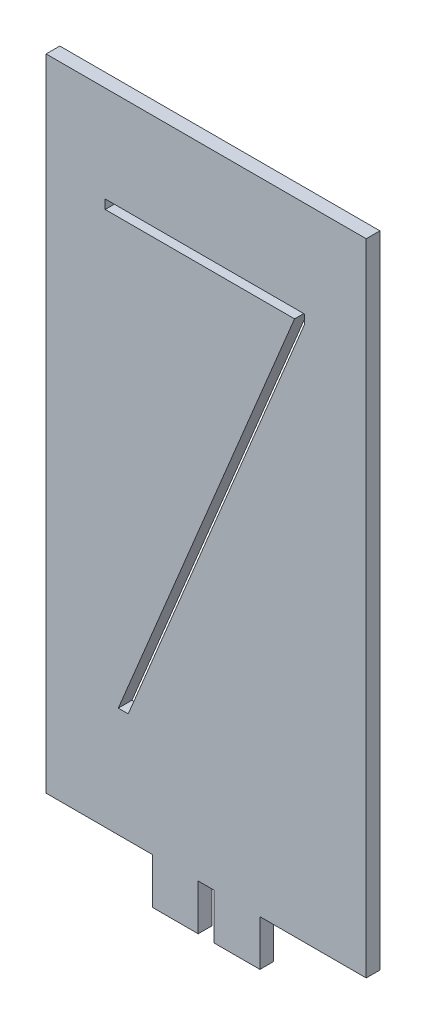
ISO-10303-21;
HEADER;
FILE_DESCRIPTION(('STEP AP214'),'2;1');
FILE_NAME('part.step','',(''),(''),'','','');
FILE_SCHEMA(('AUTOMOTIVE_DESIGN { 1 0 10303 214 1 1 1 1 }'));
ENDSEC;
DATA;
#1=APPLICATION_CONTEXT('core data for automotive mechanical design processes');
#2=APPLICATION_PROTOCOL_DEFINITION('international standard','automotive_design',2000,#1);
#3=PRODUCT_CONTEXT('',#1,'mechanical');
#4=PRODUCT('Part','Part','',(#3));
#5=PRODUCT_RELATED_PRODUCT_CATEGORY('part','',(#4));
#6=PRODUCT_DEFINITION_FORMATION('','',#4);
#7=PRODUCT_DEFINITION_CONTEXT('part definition',#1,'design');
#8=PRODUCT_DEFINITION('design','',#6,#7);
#9=PRODUCT_DEFINITION_SHAPE('','',#8);
#10=(LENGTH_UNIT() NAMED_UNIT(*) SI_UNIT(.MILLI.,.METRE.));
#11=(NAMED_UNIT(*) PLANE_ANGLE_UNIT() SI_UNIT($,.RADIAN.));
#12=(NAMED_UNIT(*) SI_UNIT($,.STERADIAN.) SOLID_ANGLE_UNIT());
#13=UNCERTAINTY_MEASURE_WITH_UNIT(LENGTH_MEASURE(1.E-05),#10,'distance_accuracy_value','');
#14=(GEOMETRIC_REPRESENTATION_CONTEXT(3) GLOBAL_UNCERTAINTY_ASSIGNED_CONTEXT((#13)) GLOBAL_UNIT_ASSIGNED_CONTEXT((#10,
#11,#12)) REPRESENTATION_CONTEXT('',''));
#15=CARTESIAN_POINT('',(0.,0.,0.));
#16=DIRECTION('',(0.,0.,1.));
#17=DIRECTION('',(1.,0.,0.));
#18=AXIS2_PLACEMENT_3D('',#15,#16,#17);
#19=CARTESIAN_POINT('',(0.,0.,1.5));
#20=DIRECTION('',(0.,1.,0.));
#21=DIRECTION('',(0.,0.,1.));
#22=AXIS2_PLACEMENT_3D('',#19,#20,#21);
#23=PLANE('',#22);
#24=DIRECTION('',(1.,0.,0.));
#25=VECTOR('',#24,1.);
#26=CARTESIAN_POINT('',(0.,0.,1.5));
#27=LINE('',#26,#25);
#28=CARTESIAN_POINT('',(11.63,0.,1.5));
#29=VERTEX_POINT('',#28);
#30=CARTESIAN_POINT('',(16.63,0.,1.5));
#31=VERTEX_POINT('',#30);
#32=EDGE_CURVE('E323',#29,#31,#27,.T.);
#33=ORIENTED_EDGE('',*,*,#32,.F.);
#34=DIRECTION('',(0.,0.,1.));
#35=VECTOR('',#34,1.);
#36=CARTESIAN_POINT('',(11.63,0.,0.));
#37=LINE('',#36,#35);
#38=CARTESIAN_POINT('',(11.63,0.,0.));
#39=VERTEX_POINT('',#38);
#40=EDGE_CURVE('E237',#39,#29,#37,.T.);
#41=ORIENTED_EDGE('',*,*,#40,.F.);
#42=DIRECTION('',(1.,0.,0.));
#43=VECTOR('',#42,1.);
#44=CARTESIAN_POINT('',(0.,0.,0.));
#45=LINE('',#44,#43);
#46=CARTESIAN_POINT('',(16.63,0.,0.));
#47=VERTEX_POINT('',#46);
#48=EDGE_CURVE('E338',#39,#47,#45,.T.);
#49=ORIENTED_EDGE('',*,*,#48,.T.);
#50=DIRECTION('',(0.,0.,1.));
#51=VECTOR('',#50,1.);
#52=CARTESIAN_POINT('',(16.63,0.,0.));
#53=LINE('',#52,#51);
#54=EDGE_CURVE('E293',#47,#31,#53,.T.);
#55=ORIENTED_EDGE('',*,*,#54,.T.);
#56=EDGE_LOOP('',(#33,#41,#49,#55));
#57=FACE_BOUND('',#56,.T.);
#58=ADVANCED_FACE('F39',(#57),#23,.F.);
#59=CARTESIAN_POINT('',(0.,0.,1.5));
#60=DIRECTION('',(1.,0.,0.));
#61=DIRECTION('',(0.,1.,0.));
#62=AXIS2_PLACEMENT_3D('',#59,#60,#61);
#63=PLANE('',#62);
#64=DIRECTION('',(0.,-1.,0.));
#65=VECTOR('',#64,1.);
#66=CARTESIAN_POINT('',(0.,0.,0.));
#67=LINE('',#66,#65);
#68=CARTESIAN_POINT('',(0.,75.,0.));
#69=VERTEX_POINT('',#68);
#70=CARTESIAN_POINT('',(0.,5.,0.));
#71=VERTEX_POINT('',#70);
#72=EDGE_CURVE('E249',#69,#71,#67,.T.);
#73=ORIENTED_EDGE('',*,*,#72,.T.);
#74=DIRECTION('',(0.,0.,1.));
#75=VECTOR('',#74,1.);
#76=CARTESIAN_POINT('',(0.,5.,0.));
#77=LINE('',#76,#75);
#78=CARTESIAN_POINT('',(0.,5.,1.5));
#79=VERTEX_POINT('',#78);
#80=EDGE_CURVE('E245',#71,#79,#77,.T.);
#81=ORIENTED_EDGE('',*,*,#80,.T.);
#82=DIRECTION('',(0.,-1.,0.));
#83=VECTOR('',#82,1.);
#84=CARTESIAN_POINT('',(0.,0.,1.5));
#85=LINE('',#84,#83);
#86=CARTESIAN_POINT('',(0.,75.,1.5));
#87=VERTEX_POINT('',#86);
#88=EDGE_CURVE('E314',#87,#79,#85,.T.);
#89=ORIENTED_EDGE('',*,*,#88,.F.);
#90=DIRECTION('',(0.,0.,-1.));
#91=VECTOR('',#90,1.);
#92=CARTESIAN_POINT('',(0.,75.,1.5));
#93=LINE('',#92,#91);
#94=EDGE_CURVE('E330',#87,#69,#93,.T.);
#95=ORIENTED_EDGE('',*,*,#94,.T.);
#96=EDGE_LOOP('',(#73,#81,#89,#95));
#97=FACE_BOUND('',#96,.T.);
#98=ADVANCED_FACE('F41',(#97),#63,.F.);
#99=CARTESIAN_POINT('',(18.38,0.,0.));
#100=VERTEX_POINT('',#99);
#101=CARTESIAN_POINT('',(23.38,0.,0.));
#102=VERTEX_POINT('',#101);
#103=EDGE_CURVE('E334',#100,#102,#45,.T.);
#104=ORIENTED_EDGE('',*,*,#103,.T.);
#105=DIRECTION('',(0.,0.,1.));
#106=VECTOR('',#105,1.);
#107=CARTESIAN_POINT('',(23.38,0.,0.));
#108=LINE('',#107,#106);
#109=CARTESIAN_POINT('',(23.38,0.,1.5));
#110=VERTEX_POINT('',#109);
#111=EDGE_CURVE('E264',#102,#110,#108,.T.);
#112=ORIENTED_EDGE('',*,*,#111,.T.);
#113=CARTESIAN_POINT('',(18.38,0.,1.5));
#114=VERTEX_POINT('',#113);
#115=EDGE_CURVE('E318',#114,#110,#27,.T.);
#116=ORIENTED_EDGE('',*,*,#115,.F.);
#117=DIRECTION('',(0.,0.,1.));
#118=VECTOR('',#117,1.);
#119=CARTESIAN_POINT('',(18.38,0.,0.));
#120=LINE('',#119,#118);
#121=EDGE_CURVE('E308',#100,#114,#120,.T.);
#122=ORIENTED_EDGE('',*,*,#121,.F.);
#123=EDGE_LOOP('',(#104,#112,#116,#122));
#124=FACE_BOUND('',#123,.T.);
#125=ADVANCED_FACE('F404',(#124),#23,.F.);
#126=CARTESIAN_POINT('',(35.,0.,1.5));
#127=DIRECTION('',(-1.,0.,0.));
#128=DIRECTION('',(0.,-1.,0.));
#129=AXIS2_PLACEMENT_3D('',#126,#127,#128);
#130=PLANE('',#129);
#131=DIRECTION('',(0.,1.,0.));
#132=VECTOR('',#131,1.);
#133=CARTESIAN_POINT('',(35.,0.,1.5));
#134=LINE('',#133,#132);
#135=CARTESIAN_POINT('',(35.,5.,1.5));
#136=VERTEX_POINT('',#135);
#137=CARTESIAN_POINT('',(35.,75.,1.5));
#138=VERTEX_POINT('',#137);
#139=EDGE_CURVE('E324',#136,#138,#134,.T.);
#140=ORIENTED_EDGE('',*,*,#139,.F.);
#141=DIRECTION('',(0.,0.,1.));
#142=VECTOR('',#141,1.);
#143=CARTESIAN_POINT('',(35.,5.,0.));
#144=LINE('',#143,#142);
#145=CARTESIAN_POINT('',(35.,5.,0.));
#146=VERTEX_POINT('',#145);
#147=EDGE_CURVE('E274',#146,#136,#144,.T.);
#148=ORIENTED_EDGE('',*,*,#147,.F.);
#149=DIRECTION('',(0.,1.,0.));
#150=VECTOR('',#149,1.);
#151=CARTESIAN_POINT('',(35.,0.,0.));
#152=LINE('',#151,#150);
#153=CARTESIAN_POINT('',(35.,75.,0.));
#154=VERTEX_POINT('',#153);
#155=EDGE_CURVE('E339',#146,#154,#152,.T.);
#156=ORIENTED_EDGE('',*,*,#155,.T.);
#157=DIRECTION('',(0.,0.,-1.));
#158=VECTOR('',#157,1.);
#159=CARTESIAN_POINT('',(35.,75.,1.5));
#160=LINE('',#159,#158);
#161=EDGE_CURVE('E347',#138,#154,#160,.T.);
#162=ORIENTED_EDGE('',*,*,#161,.F.);
#163=EDGE_LOOP('',(#140,#148,#156,#162));
#164=FACE_BOUND('',#163,.T.);
#165=ADVANCED_FACE('F412',(#164),#130,.F.);
#166=CARTESIAN_POINT('',(0.,75.,1.5));
#167=DIRECTION('',(0.,-1.,0.));
#168=DIRECTION('',(0.,0.,-1.));
#169=AXIS2_PLACEMENT_3D('',#166,#167,#168);
#170=PLANE('',#169);
#171=DIRECTION('',(-1.,0.,0.));
#172=VECTOR('',#171,1.);
#173=CARTESIAN_POINT('',(0.,75.,0.));
#174=LINE('',#173,#172);
#175=EDGE_CURVE('E319',#154,#69,#174,.T.);
#176=ORIENTED_EDGE('',*,*,#175,.T.);
#177=ORIENTED_EDGE('',*,*,#94,.F.);
#178=DIRECTION('',(-1.,0.,0.));
#179=VECTOR('',#178,1.);
#180=CARTESIAN_POINT('',(0.,75.,1.5));
#181=LINE('',#180,#179);
#182=EDGE_CURVE('E327',#138,#87,#181,.T.);
#183=ORIENTED_EDGE('',*,*,#182,.F.);
#184=ORIENTED_EDGE('',*,*,#161,.T.);
#185=EDGE_LOOP('',(#176,#177,#183,#184));
#186=FACE_BOUND('',#185,.T.);
#187=ADVANCED_FACE('F417',(#186),#170,.F.);
#188=CARTESIAN_POINT('',(0.,0.,1.5));
#189=DIRECTION('',(0.,0.,-1.));
#190=DIRECTION('',(-1.,0.,0.));
#191=AXIS2_PLACEMENT_3D('',#188,#189,#190);
#192=PLANE('',#191);
#193=DIRECTION('',(1.,0.,0.));
#194=VECTOR('',#193,1.);
#195=CARTESIAN_POINT('',(27.1675061690048,63.5,1.5));
#196=LINE('',#195,#194);
#197=CARTESIAN_POINT('',(6.45924065450965,63.5,1.5));
#198=VERTEX_POINT('',#197);
#199=CARTESIAN_POINT('',(27.1675061690048,63.5,1.5));
#200=VERTEX_POINT('',#199);
#201=EDGE_CURVE('E183',#198,#200,#196,.T.);
#202=ORIENTED_EDGE('',*,*,#201,.F.);
#203=DIRECTION('',(0.,-1.,0.));
#204=VECTOR('',#203,1.);
#205=CARTESIAN_POINT('',(6.45924065450965,63.5,1.5));
#206=LINE('',#205,#204);
#207=CARTESIAN_POINT('',(6.45924065450965,64.5,1.5));
#208=VERTEX_POINT('',#207);
#209=EDGE_CURVE('E55',#208,#198,#206,.T.);
#210=ORIENTED_EDGE('',*,*,#209,.F.);
#211=DIRECTION('',(-1.,0.,0.));
#212=VECTOR('',#211,1.);
#213=CARTESIAN_POINT('',(6.45924065450965,64.5,1.5));
#214=LINE('',#213,#212);
#215=CARTESIAN_POINT('',(28.25,64.5,1.5));
#216=VERTEX_POINT('',#215);
#217=EDGE_CURVE('E207',#216,#208,#214,.T.);
#218=ORIENTED_EDGE('',*,*,#217,.F.);
#219=DIRECTION('',(0.,1.,0.));
#220=VECTOR('',#219,1.);
#221=CARTESIAN_POINT('',(28.25,64.5,1.5));
#222=LINE('',#221,#220);
#223=CARTESIAN_POINT('',(28.25,63.5,1.5));
#224=VERTEX_POINT('',#223);
#225=EDGE_CURVE('E203',#224,#216,#222,.T.);
#226=ORIENTED_EDGE('',*,*,#225,.F.);
#227=DIRECTION('',(0.382892771956685,0.923792793424654,0.));
#228=VECTOR('',#227,1.);
#229=CARTESIAN_POINT('',(28.25,63.5,1.5));
#230=LINE('',#229,#228);
#231=CARTESIAN_POINT('',(8.97672354372722,17.,1.5));
#232=VERTEX_POINT('',#231);
#233=EDGE_CURVE('E196',#232,#224,#230,.T.);
#234=ORIENTED_EDGE('',*,*,#233,.F.);
#235=DIRECTION('',(1.,0.,0.));
#236=VECTOR('',#235,1.);
#237=CARTESIAN_POINT('',(8.97672354372722,17.,1.5));
#238=LINE('',#237,#236);
#239=CARTESIAN_POINT('',(7.89422971273203,17.,1.5));
#240=VERTEX_POINT('',#239);
#241=EDGE_CURVE('E192',#240,#232,#238,.T.);
#242=ORIENTED_EDGE('',*,*,#241,.F.);
#243=DIRECTION('',(-0.382892771956685,-0.923792793424654,0.));
#244=VECTOR('',#243,1.);
#245=CARTESIAN_POINT('',(7.89422971273203,17.,1.5));
#246=LINE('',#245,#244);
#247=EDGE_CURVE('E173',#200,#240,#246,.T.);
#248=ORIENTED_EDGE('',*,*,#247,.F.);
#249=EDGE_LOOP('',(#202,#210,#218,#226,#234,#242,#248));
#250=FACE_BOUND('',#249,.T.);
#251=ORIENTED_EDGE('',*,*,#88,.T.);
#252=DIRECTION('',(-1.,0.,0.));
#253=VECTOR('',#252,1.);
#254=CARTESIAN_POINT('',(0.,5.,1.5));
#255=LINE('',#254,#253);
#256=CARTESIAN_POINT('',(11.63,5.,1.5));
#257=VERTEX_POINT('',#256);
#258=EDGE_CURVE('E233',#257,#79,#255,.T.);
#259=ORIENTED_EDGE('',*,*,#258,.F.);
#260=DIRECTION('',(0.,1.,0.));
#261=VECTOR('',#260,1.);
#262=CARTESIAN_POINT('',(11.63,0.,1.5));
#263=LINE('',#262,#261);
#264=EDGE_CURVE('E238',#29,#257,#263,.T.);
#265=ORIENTED_EDGE('',*,*,#264,.F.);
#266=ORIENTED_EDGE('',*,*,#32,.T.);
#267=DIRECTION('',(0.,-1.,0.));
#268=VECTOR('',#267,1.);
#269=CARTESIAN_POINT('',(16.63,0.,1.5));
#270=LINE('',#269,#268);
#271=CARTESIAN_POINT('',(16.63,5.,1.5));
#272=VERTEX_POINT('',#271);
#273=EDGE_CURVE('E214',#272,#31,#270,.T.);
#274=ORIENTED_EDGE('',*,*,#273,.F.);
#275=DIRECTION('',(-1.,0.,0.));
#276=VECTOR('',#275,1.);
#277=CARTESIAN_POINT('',(16.63,5.,1.5));
#278=LINE('',#277,#276);
#279=CARTESIAN_POINT('',(18.38,5.,1.5));
#280=VERTEX_POINT('',#279);
#281=EDGE_CURVE('E285',#280,#272,#278,.T.);
#282=ORIENTED_EDGE('',*,*,#281,.F.);
#283=DIRECTION('',(0.,1.,0.));
#284=VECTOR('',#283,1.);
#285=CARTESIAN_POINT('',(18.38,0.,1.5));
#286=LINE('',#285,#284);
#287=EDGE_CURVE('E296',#114,#280,#286,.T.);
#288=ORIENTED_EDGE('',*,*,#287,.F.);
#289=ORIENTED_EDGE('',*,*,#115,.T.);
#290=DIRECTION('',(0.,-1.,0.));
#291=VECTOR('',#290,1.);
#292=CARTESIAN_POINT('',(23.38,5.,1.5));
#293=LINE('',#292,#291);
#294=CARTESIAN_POINT('',(23.38,5.,1.5));
#295=VERTEX_POINT('',#294);
#296=EDGE_CURVE('E265',#295,#110,#293,.T.);
#297=ORIENTED_EDGE('',*,*,#296,.F.);
#298=DIRECTION('',(-1.,0.,0.));
#299=VECTOR('',#298,1.);
#300=CARTESIAN_POINT('',(23.38,5.,1.5));
#301=LINE('',#300,#299);
#302=EDGE_CURVE('E260',#136,#295,#301,.T.);
#303=ORIENTED_EDGE('',*,*,#302,.F.);
#304=ORIENTED_EDGE('',*,*,#139,.T.);
#305=ORIENTED_EDGE('',*,*,#182,.T.);
#306=EDGE_LOOP('',(#251,#259,#265,#266,#274,#282,#288,#289,#297,#303,#304,#305));
#307=FACE_BOUND('',#306,.T.);
#308=ADVANCED_FACE('F188',(#250,#307),#192,.F.);
#309=CARTESIAN_POINT('',(0.,0.,0.));
#310=DIRECTION('',(0.,0.,-1.));
#311=DIRECTION('',(-1.,0.,0.));
#312=AXIS2_PLACEMENT_3D('',#309,#310,#311);
#313=PLANE('',#312);
#314=DIRECTION('',(0.,1.,0.));
#315=VECTOR('',#314,1.);
#316=CARTESIAN_POINT('',(6.45924065450965,0.,0.));
#317=LINE('',#316,#315);
#318=CARTESIAN_POINT('',(6.45924065450965,63.5,0.));
#319=VERTEX_POINT('',#318);
#320=CARTESIAN_POINT('',(6.45924065450965,64.5,0.));
#321=VERTEX_POINT('',#320);
#322=EDGE_CURVE('E11',#319,#321,#317,.T.);
#323=ORIENTED_EDGE('',*,*,#322,.F.);
#324=DIRECTION('',(-1.,0.,0.));
#325=VECTOR('',#324,1.);
#326=CARTESIAN_POINT('',(0.,63.5,0.));
#327=LINE('',#326,#325);
#328=CARTESIAN_POINT('',(27.1675061690048,63.5,0.));
#329=VERTEX_POINT('',#328);
#330=EDGE_CURVE('E351',#329,#319,#327,.T.);
#331=ORIENTED_EDGE('',*,*,#330,.F.);
#332=DIRECTION('',(0.382892771956685,0.923792793424654,0.));
#333=VECTOR('',#332,1.);
#334=CARTESIAN_POINT('',(0.723750447867871,-0.299979407894811,0.));
#335=LINE('',#334,#333);
#336=CARTESIAN_POINT('',(7.89422971273203,17.,0.));
#337=VERTEX_POINT('',#336);
#338=EDGE_CURVE('E176',#337,#329,#335,.T.);
#339=ORIENTED_EDGE('',*,*,#338,.F.);
#340=DIRECTION('',(-1.,0.,0.));
#341=VECTOR('',#340,1.);
#342=CARTESIAN_POINT('',(0.,17.,0.));
#343=LINE('',#342,#341);
#344=CARTESIAN_POINT('',(8.97672354372722,17.,0.));
#345=VERTEX_POINT('',#344);
#346=EDGE_CURVE('E356',#345,#337,#343,.T.);
#347=ORIENTED_EDGE('',*,*,#346,.F.);
#348=DIRECTION('',(-0.382892771956685,-0.923792793424654,0.));
#349=VECTOR('',#348,1.);
#350=CARTESIAN_POINT('',(1.64754324129254,-0.682872179851502,0.));
#351=LINE('',#350,#349);
#352=CARTESIAN_POINT('',(28.25,63.5,0.));
#353=VERTEX_POINT('',#352);
#354=EDGE_CURVE('E359',#353,#345,#351,.T.);
#355=ORIENTED_EDGE('',*,*,#354,.F.);
#356=DIRECTION('',(0.,-1.,0.));
#357=VECTOR('',#356,1.);
#358=CARTESIAN_POINT('',(28.25,0.,0.));
#359=LINE('',#358,#357);
#360=CARTESIAN_POINT('',(28.25,64.5,0.));
#361=VERTEX_POINT('',#360);
#362=EDGE_CURVE('E362',#361,#353,#359,.T.);
#363=ORIENTED_EDGE('',*,*,#362,.F.);
#364=DIRECTION('',(1.,0.,0.));
#365=VECTOR('',#364,1.);
#366=CARTESIAN_POINT('',(0.,64.5,0.));
#367=LINE('',#366,#365);
#368=EDGE_CURVE('E48',#321,#361,#367,.T.);
#369=ORIENTED_EDGE('',*,*,#368,.F.);
#370=EDGE_LOOP('',(#323,#331,#339,#347,#355,#363,#369));
#371=FACE_BOUND('',#370,.T.);
#372=DIRECTION('',(-1.,0.,0.));
#373=VECTOR('',#372,1.);
#374=CARTESIAN_POINT('',(0.,5.,0.));
#375=LINE('',#374,#373);
#376=CARTESIAN_POINT('',(11.63,5.,0.));
#377=VERTEX_POINT('',#376);
#378=EDGE_CURVE('E232',#377,#71,#375,.T.);
#379=ORIENTED_EDGE('',*,*,#378,.T.);
#380=ORIENTED_EDGE('',*,*,#72,.F.);
#381=ORIENTED_EDGE('',*,*,#175,.F.);
#382=ORIENTED_EDGE('',*,*,#155,.F.);
#383=DIRECTION('',(-1.,0.,0.));
#384=VECTOR('',#383,1.);
#385=CARTESIAN_POINT('',(23.38,5.,0.));
#386=LINE('',#385,#384);
#387=CARTESIAN_POINT('',(23.38,5.,0.));
#388=VERTEX_POINT('',#387);
#389=EDGE_CURVE('E259',#146,#388,#386,.T.);
#390=ORIENTED_EDGE('',*,*,#389,.T.);
#391=DIRECTION('',(0.,-1.,0.));
#392=VECTOR('',#391,1.);
#393=CARTESIAN_POINT('',(23.38,5.,0.));
#394=LINE('',#393,#392);
#395=EDGE_CURVE('E255',#388,#102,#394,.T.);
#396=ORIENTED_EDGE('',*,*,#395,.T.);
#397=ORIENTED_EDGE('',*,*,#103,.F.);
#398=DIRECTION('',(0.,1.,0.));
#399=VECTOR('',#398,1.);
#400=CARTESIAN_POINT('',(18.38,0.,0.));
#401=LINE('',#400,#399);
#402=CARTESIAN_POINT('',(18.38,5.,0.));
#403=VERTEX_POINT('',#402);
#404=EDGE_CURVE('E284',#100,#403,#401,.T.);
#405=ORIENTED_EDGE('',*,*,#404,.T.);
#406=DIRECTION('',(-1.,0.,0.));
#407=VECTOR('',#406,1.);
#408=CARTESIAN_POINT('',(16.63,5.,0.));
#409=LINE('',#408,#407);
#410=CARTESIAN_POINT('',(16.63,5.,0.));
#411=VERTEX_POINT('',#410);
#412=EDGE_CURVE('E289',#403,#411,#409,.T.);
#413=ORIENTED_EDGE('',*,*,#412,.T.);
#414=DIRECTION('',(0.,-1.,0.));
#415=VECTOR('',#414,1.);
#416=CARTESIAN_POINT('',(16.63,0.,0.));
#417=LINE('',#416,#415);
#418=EDGE_CURVE('E280',#411,#47,#417,.T.);
#419=ORIENTED_EDGE('',*,*,#418,.T.);
#420=ORIENTED_EDGE('',*,*,#48,.F.);
#421=DIRECTION('',(0.,1.,0.));
#422=VECTOR('',#421,1.);
#423=CARTESIAN_POINT('',(11.63,0.,0.));
#424=LINE('',#423,#422);
#425=EDGE_CURVE('E228',#39,#377,#424,.T.);
#426=ORIENTED_EDGE('',*,*,#425,.T.);
#427=EDGE_LOOP('',(#379,#380,#381,#382,#390,#396,#397,#405,#413,#419,#420,#426));
#428=FACE_BOUND('',#427,.T.);
#429=ADVANCED_FACE('F379',(#371,#428),#313,.T.);
#430=CARTESIAN_POINT('',(16.63,0.,0.));
#431=DIRECTION('',(-1.,0.,0.));
#432=DIRECTION('',(0.,0.,1.));
#433=AXIS2_PLACEMENT_3D('',#430,#431,#432);
#434=PLANE('',#433);
#435=ORIENTED_EDGE('',*,*,#273,.T.);
#436=ORIENTED_EDGE('',*,*,#54,.F.);
#437=ORIENTED_EDGE('',*,*,#418,.F.);
#438=DIRECTION('',(0.,0.,1.));
#439=VECTOR('',#438,1.);
#440=CARTESIAN_POINT('',(16.63,5.,0.));
#441=LINE('',#440,#439);
#442=EDGE_CURVE('E268',#411,#272,#441,.T.);
#443=ORIENTED_EDGE('',*,*,#442,.T.);
#444=EDGE_LOOP('',(#435,#436,#437,#443));
#445=FACE_BOUND('',#444,.T.);
#446=ADVANCED_FACE('F467',(#445),#434,.F.);
#447=CARTESIAN_POINT('',(16.63,5.,0.));
#448=DIRECTION('',(0.,1.,0.));
#449=DIRECTION('',(0.,0.,1.));
#450=AXIS2_PLACEMENT_3D('',#447,#448,#449);
#451=PLANE('',#450);
#452=ORIENTED_EDGE('',*,*,#281,.T.);
#453=ORIENTED_EDGE('',*,*,#442,.F.);
#454=ORIENTED_EDGE('',*,*,#412,.F.);
#455=DIRECTION('',(0.,0.,1.));
#456=VECTOR('',#455,1.);
#457=CARTESIAN_POINT('',(18.38,5.,0.));
#458=LINE('',#457,#456);
#459=EDGE_CURVE('E305',#403,#280,#458,.T.);
#460=ORIENTED_EDGE('',*,*,#459,.T.);
#461=EDGE_LOOP('',(#452,#453,#454,#460));
#462=FACE_BOUND('',#461,.T.);
#463=ADVANCED_FACE('F439',(#462),#451,.F.);
#464=CARTESIAN_POINT('',(18.38,0.,0.));
#465=DIRECTION('',(1.,0.,0.));
#466=DIRECTION('',(0.,0.,-1.));
#467=AXIS2_PLACEMENT_3D('',#464,#465,#466);
#468=PLANE('',#467);
#469=ORIENTED_EDGE('',*,*,#287,.T.);
#470=ORIENTED_EDGE('',*,*,#459,.F.);
#471=ORIENTED_EDGE('',*,*,#404,.F.);
#472=ORIENTED_EDGE('',*,*,#121,.T.);
#473=EDGE_LOOP('',(#469,#470,#471,#472));
#474=FACE_BOUND('',#473,.T.);
#475=ADVANCED_FACE('F437',(#474),#468,.F.);
#476=CARTESIAN_POINT('',(23.38,5.,0.));
#477=DIRECTION('',(-1.,0.,0.));
#478=DIRECTION('',(0.,0.,1.));
#479=AXIS2_PLACEMENT_3D('',#476,#477,#478);
#480=PLANE('',#479);
#481=ORIENTED_EDGE('',*,*,#296,.T.);
#482=ORIENTED_EDGE('',*,*,#111,.F.);
#483=ORIENTED_EDGE('',*,*,#395,.F.);
#484=DIRECTION('',(0.,0.,1.));
#485=VECTOR('',#484,1.);
#486=CARTESIAN_POINT('',(23.38,5.,0.));
#487=LINE('',#486,#485);
#488=EDGE_CURVE('E242',#388,#295,#487,.T.);
#489=ORIENTED_EDGE('',*,*,#488,.T.);
#490=EDGE_LOOP('',(#481,#482,#483,#489));
#491=FACE_BOUND('',#490,.T.);
#492=ADVANCED_FACE('F425',(#491),#480,.F.);
#493=CARTESIAN_POINT('',(23.38,5.,0.));
#494=DIRECTION('',(0.,1.,0.));
#495=DIRECTION('',(0.,0.,1.));
#496=AXIS2_PLACEMENT_3D('',#493,#494,#495);
#497=PLANE('',#496);
#498=ORIENTED_EDGE('',*,*,#302,.T.);
#499=ORIENTED_EDGE('',*,*,#488,.F.);
#500=ORIENTED_EDGE('',*,*,#389,.F.);
#501=ORIENTED_EDGE('',*,*,#147,.T.);
#502=EDGE_LOOP('',(#498,#499,#500,#501));
#503=FACE_BOUND('',#502,.T.);
#504=ADVANCED_FACE('F427',(#503),#497,.F.);
#505=CARTESIAN_POINT('',(0.,5.,0.));
#506=DIRECTION('',(0.,1.,0.));
#507=DIRECTION('',(0.,0.,1.));
#508=AXIS2_PLACEMENT_3D('',#505,#506,#507);
#509=PLANE('',#508);
#510=ORIENTED_EDGE('',*,*,#258,.T.);
#511=ORIENTED_EDGE('',*,*,#80,.F.);
#512=ORIENTED_EDGE('',*,*,#378,.F.);
#513=DIRECTION('',(0.,0.,1.));
#514=VECTOR('',#513,1.);
#515=CARTESIAN_POINT('',(11.63,5.,0.));
#516=LINE('',#515,#514);
#517=EDGE_CURVE('E250',#377,#257,#516,.T.);
#518=ORIENTED_EDGE('',*,*,#517,.T.);
#519=EDGE_LOOP('',(#510,#511,#512,#518));
#520=FACE_BOUND('',#519,.T.);
#521=ADVANCED_FACE('F397',(#520),#509,.F.);
#522=CARTESIAN_POINT('',(11.63,0.,0.));
#523=DIRECTION('',(1.,0.,0.));
#524=DIRECTION('',(0.,1.,0.));
#525=AXIS2_PLACEMENT_3D('',#522,#523,#524);
#526=PLANE('',#525);
#527=ORIENTED_EDGE('',*,*,#264,.T.);
#528=ORIENTED_EDGE('',*,*,#517,.F.);
#529=ORIENTED_EDGE('',*,*,#425,.F.);
#530=ORIENTED_EDGE('',*,*,#40,.T.);
#531=EDGE_LOOP('',(#527,#528,#529,#530));
#532=FACE_BOUND('',#531,.T.);
#533=ADVANCED_FACE('F390',(#532),#526,.F.);
#534=CARTESIAN_POINT('',(6.45924065450965,63.5,-18.5));
#535=DIRECTION('',(-1.,0.,0.));
#536=DIRECTION('',(0.,0.,1.));
#537=AXIS2_PLACEMENT_3D('',#534,#535,#536);
#538=PLANE('',#537);
#539=ORIENTED_EDGE('',*,*,#322,.T.);
#540=DIRECTION('',(0.,0.,1.));
#541=VECTOR('',#540,1.);
#542=CARTESIAN_POINT('',(6.45924065450965,64.5,-18.5));
#543=LINE('',#542,#541);
#544=EDGE_CURVE('E211',#321,#208,#543,.T.);
#545=ORIENTED_EDGE('',*,*,#544,.T.);
#546=ORIENTED_EDGE('',*,*,#209,.T.);
#547=DIRECTION('',(0.,0.,1.));
#548=VECTOR('',#547,1.);
#549=CARTESIAN_POINT('',(6.45924065450965,63.5,-18.5));
#550=LINE('',#549,#548);
#551=EDGE_CURVE('E180',#319,#198,#550,.T.);
#552=ORIENTED_EDGE('',*,*,#551,.F.);
#553=EDGE_LOOP('',(#539,#545,#546,#552));
#554=FACE_BOUND('',#553,.T.);
#555=ADVANCED_FACE('F388',(#554),#538,.F.);
#556=CARTESIAN_POINT('',(6.45924065450965,64.5,-18.5));
#557=DIRECTION('',(0.,1.,0.));
#558=DIRECTION('',(0.,0.,1.));
#559=AXIS2_PLACEMENT_3D('',#556,#557,#558);
#560=PLANE('',#559);
#561=ORIENTED_EDGE('',*,*,#368,.T.);
#562=DIRECTION('',(0.,0.,1.));
#563=VECTOR('',#562,1.);
#564=CARTESIAN_POINT('',(28.25,64.5,-18.5));
#565=LINE('',#564,#563);
#566=EDGE_CURVE('E215',#361,#216,#565,.T.);
#567=ORIENTED_EDGE('',*,*,#566,.T.);
#568=ORIENTED_EDGE('',*,*,#217,.T.);
#569=ORIENTED_EDGE('',*,*,#544,.F.);
#570=EDGE_LOOP('',(#561,#567,#568,#569));
#571=FACE_BOUND('',#570,.T.);
#572=ADVANCED_FACE('F369',(#571),#560,.F.);
#573=CARTESIAN_POINT('',(28.25,64.5,-18.5));
#574=DIRECTION('',(1.,0.,0.));
#575=DIRECTION('',(0.,0.,-1.));
#576=AXIS2_PLACEMENT_3D('',#573,#574,#575);
#577=PLANE('',#576);
#578=ORIENTED_EDGE('',*,*,#362,.T.);
#579=DIRECTION('',(0.,0.,1.));
#580=VECTOR('',#579,1.);
#581=CARTESIAN_POINT('',(28.25,63.5,-18.5));
#582=LINE('',#581,#580);
#583=EDGE_CURVE('E218',#353,#224,#582,.T.);
#584=ORIENTED_EDGE('',*,*,#583,.T.);
#585=ORIENTED_EDGE('',*,*,#225,.T.);
#586=ORIENTED_EDGE('',*,*,#566,.F.);
#587=EDGE_LOOP('',(#578,#584,#585,#586));
#588=FACE_BOUND('',#587,.T.);
#589=ADVANCED_FACE('F374',(#588),#577,.F.);
#590=CARTESIAN_POINT('',(28.25,63.5,-18.5));
#591=DIRECTION('',(0.923792793424654,-0.382892771956685,0.));
#592=DIRECTION('',(0.382892771956685,0.923792793424654,0.));
#593=AXIS2_PLACEMENT_3D('',#590,#591,#592);
#594=PLANE('',#593);
#595=ORIENTED_EDGE('',*,*,#354,.T.);
#596=DIRECTION('',(0.,0.,1.));
#597=VECTOR('',#596,1.);
#598=CARTESIAN_POINT('',(8.97672354372722,17.,-18.5));
#599=LINE('',#598,#597);
#600=EDGE_CURVE('E221',#345,#232,#599,.T.);
#601=ORIENTED_EDGE('',*,*,#600,.T.);
#602=ORIENTED_EDGE('',*,*,#233,.T.);
#603=ORIENTED_EDGE('',*,*,#583,.F.);
#604=EDGE_LOOP('',(#595,#601,#602,#603));
#605=FACE_BOUND('',#604,.T.);
#606=ADVANCED_FACE('F384',(#605),#594,.F.);
#607=CARTESIAN_POINT('',(8.97672354372722,17.,-18.5));
#608=DIRECTION('',(0.,-1.,0.));
#609=DIRECTION('',(0.,0.,-1.));
#610=AXIS2_PLACEMENT_3D('',#607,#608,#609);
#611=PLANE('',#610);
#612=ORIENTED_EDGE('',*,*,#346,.T.);
#613=DIRECTION('',(0.,0.,1.));
#614=VECTOR('',#613,1.);
#615=CARTESIAN_POINT('',(7.89422971273203,17.,-18.5));
#616=LINE('',#615,#614);
#617=EDGE_CURVE('E179',#337,#240,#616,.T.);
#618=ORIENTED_EDGE('',*,*,#617,.T.);
#619=ORIENTED_EDGE('',*,*,#241,.T.);
#620=ORIENTED_EDGE('',*,*,#600,.F.);
#621=EDGE_LOOP('',(#612,#618,#619,#620));
#622=FACE_BOUND('',#621,.T.);
#623=ADVANCED_FACE('F386',(#622),#611,.F.);
#624=CARTESIAN_POINT('',(7.89422971273203,17.,-18.5));
#625=DIRECTION('',(-0.923792793424654,0.382892771956685,0.));
#626=DIRECTION('',(-0.382892771956685,-0.923792793424654,0.));
#627=AXIS2_PLACEMENT_3D('',#624,#625,#626);
#628=PLANE('',#627);
#629=ORIENTED_EDGE('',*,*,#338,.T.);
#630=DIRECTION('',(0.,0.,1.));
#631=VECTOR('',#630,1.);
#632=CARTESIAN_POINT('',(27.1675061690048,63.5,-18.5));
#633=LINE('',#632,#631);
#634=EDGE_CURVE('E63',#329,#200,#633,.T.);
#635=ORIENTED_EDGE('',*,*,#634,.T.);
#636=ORIENTED_EDGE('',*,*,#247,.T.);
#637=ORIENTED_EDGE('',*,*,#617,.F.);
#638=EDGE_LOOP('',(#629,#635,#636,#637));
#639=FACE_BOUND('',#638,.T.);
#640=ADVANCED_FACE('F170',(#639),#628,.F.);
#641=CARTESIAN_POINT('',(27.1675061690048,63.5,-18.5));
#642=DIRECTION('',(0.,-1.,0.));
#643=DIRECTION('',(0.,0.,-1.));
#644=AXIS2_PLACEMENT_3D('',#641,#642,#643);
#645=PLANE('',#644);
#646=ORIENTED_EDGE('',*,*,#330,.T.);
#647=ORIENTED_EDGE('',*,*,#551,.T.);
#648=ORIENTED_EDGE('',*,*,#201,.T.);
#649=ORIENTED_EDGE('',*,*,#634,.F.);
#650=EDGE_LOOP('',(#646,#647,#648,#649));
#651=FACE_BOUND('',#650,.T.);
#652=ADVANCED_FACE('F184',(#651),#645,.F.);
#653=CLOSED_SHELL('',(#58,#98,#125,#165,#187,#308,#429,#446,#463,#475,#492,#504,#521,#533,#555,
#572,#589,#606,#623,#640,#652));
#654=MANIFOLD_SOLID_BREP('B2',#653);
#655=ADVANCED_BREP_SHAPE_REPRESENTATION('',(#18,#654),#14);
#656=SHAPE_DEFINITION_REPRESENTATION(#9,#655);
ENDSEC;
END-ISO-10303-21;
